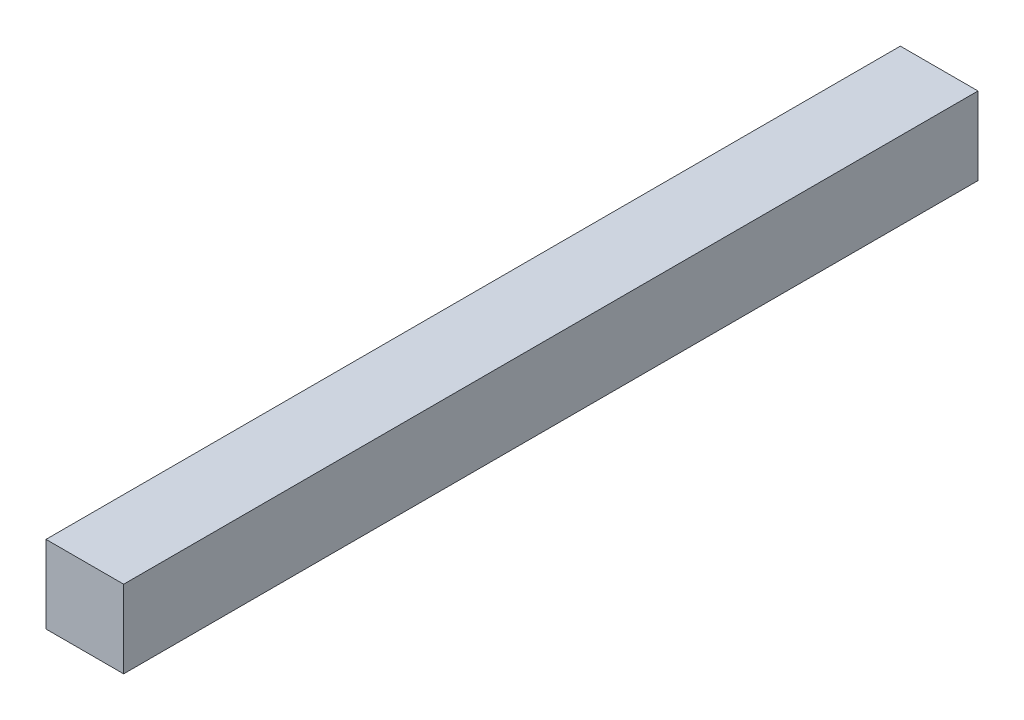
ISO-10303-21;
HEADER;
FILE_DESCRIPTION(('STEP AP214'),'2;1');
FILE_NAME('part.step','',(''),(''),'','','');
FILE_SCHEMA(('AUTOMOTIVE_DESIGN { 1 0 10303 214 1 1 1 1 }'));
ENDSEC;
DATA;
#1=APPLICATION_CONTEXT('core data for automotive mechanical design processes');
#2=APPLICATION_PROTOCOL_DEFINITION('international standard','automotive_design',2000,#1);
#3=PRODUCT_CONTEXT('',#1,'mechanical');
#4=PRODUCT('Part','Part','',(#3));
#5=PRODUCT_RELATED_PRODUCT_CATEGORY('part','',(#4));
#6=PRODUCT_DEFINITION_FORMATION('','',#4);
#7=PRODUCT_DEFINITION_CONTEXT('part definition',#1,'design');
#8=PRODUCT_DEFINITION('design','',#6,#7);
#9=PRODUCT_DEFINITION_SHAPE('','',#8);
#10=(LENGTH_UNIT() NAMED_UNIT(*) SI_UNIT(.MILLI.,.METRE.));
#11=(NAMED_UNIT(*) PLANE_ANGLE_UNIT() SI_UNIT($,.RADIAN.));
#12=(NAMED_UNIT(*) SI_UNIT($,.STERADIAN.) SOLID_ANGLE_UNIT());
#13=UNCERTAINTY_MEASURE_WITH_UNIT(LENGTH_MEASURE(1.E-05),#10,'distance_accuracy_value','');
#14=(GEOMETRIC_REPRESENTATION_CONTEXT(3) GLOBAL_UNCERTAINTY_ASSIGNED_CONTEXT((#13)) GLOBAL_UNIT_ASSIGNED_CONTEXT((#10,
#11,#12)) REPRESENTATION_CONTEXT('',''));
#15=CARTESIAN_POINT('',(0.,0.,0.));
#16=DIRECTION('',(0.,0.,1.));
#17=DIRECTION('',(1.,0.,0.));
#18=AXIS2_PLACEMENT_3D('',#15,#16,#17);
#19=CARTESIAN_POINT('',(15.,-15.,165.));
#20=DIRECTION('',(-1.,0.,0.));
#21=DIRECTION('',(0.,0.,1.));
#22=AXIS2_PLACEMENT_3D('',#19,#20,#21);
#23=PLANE('',#22);
#24=DIRECTION('',(0.,1.,0.));
#25=VECTOR('',#24,1.);
#26=CARTESIAN_POINT('',(15.,-15.,-165.));
#27=LINE('',#26,#25);
#28=CARTESIAN_POINT('',(15.,-15.,-165.));
#29=VERTEX_POINT('',#28);
#30=CARTESIAN_POINT('',(15.,15.,-165.));
#31=VERTEX_POINT('',#30);
#32=EDGE_CURVE('E98',#29,#31,#27,.T.);
#33=ORIENTED_EDGE('',*,*,#32,.T.);
#34=DIRECTION('',(0.,0.,-1.));
#35=VECTOR('',#34,1.);
#36=CARTESIAN_POINT('',(15.,15.,165.));
#37=LINE('',#36,#35);
#38=CARTESIAN_POINT('',(15.,15.,165.));
#39=VERTEX_POINT('',#38);
#40=EDGE_CURVE('E11',#39,#31,#37,.T.);
#41=ORIENTED_EDGE('',*,*,#40,.F.);
#42=DIRECTION('',(0.,1.,0.));
#43=VECTOR('',#42,1.);
#44=CARTESIAN_POINT('',(15.,-15.,165.));
#45=LINE('',#44,#43);
#46=CARTESIAN_POINT('',(15.,-15.,165.));
#47=VERTEX_POINT('',#46);
#48=EDGE_CURVE('E86',#47,#39,#45,.T.);
#49=ORIENTED_EDGE('',*,*,#48,.F.);
#50=DIRECTION('',(0.,0.,-1.));
#51=VECTOR('',#50,1.);
#52=CARTESIAN_POINT('',(15.,-15.,165.));
#53=LINE('',#52,#51);
#54=EDGE_CURVE('E94',#47,#29,#53,.T.);
#55=ORIENTED_EDGE('',*,*,#54,.T.);
#56=EDGE_LOOP('',(#33,#41,#49,#55));
#57=FACE_BOUND('',#56,.T.);
#58=ADVANCED_FACE('F35',(#57),#23,.F.);
#59=CARTESIAN_POINT('',(-15.,15.,165.));
#60=DIRECTION('',(0.,-1.,0.));
#61=DIRECTION('',(0.,0.,-1.));
#62=AXIS2_PLACEMENT_3D('',#59,#60,#61);
#63=PLANE('',#62);
#64=DIRECTION('',(-1.,0.,0.));
#65=VECTOR('',#64,1.);
#66=CARTESIAN_POINT('',(-15.,15.,-165.));
#67=LINE('',#66,#65);
#68=CARTESIAN_POINT('',(-15.,15.,-165.));
#69=VERTEX_POINT('',#68);
#70=EDGE_CURVE('E90',#31,#69,#67,.T.);
#71=ORIENTED_EDGE('',*,*,#70,.T.);
#72=DIRECTION('',(0.,0.,-1.));
#73=VECTOR('',#72,1.);
#74=CARTESIAN_POINT('',(-15.,15.,165.));
#75=LINE('',#74,#73);
#76=CARTESIAN_POINT('',(-15.,15.,165.));
#77=VERTEX_POINT('',#76);
#78=EDGE_CURVE('E43',#77,#69,#75,.T.);
#79=ORIENTED_EDGE('',*,*,#78,.F.);
#80=DIRECTION('',(-1.,0.,0.));
#81=VECTOR('',#80,1.);
#82=CARTESIAN_POINT('',(-15.,15.,165.));
#83=LINE('',#82,#81);
#84=EDGE_CURVE('E81',#39,#77,#83,.T.);
#85=ORIENTED_EDGE('',*,*,#84,.F.);
#86=ORIENTED_EDGE('',*,*,#40,.T.);
#87=EDGE_LOOP('',(#71,#79,#85,#86));
#88=FACE_BOUND('',#87,.T.);
#89=ADVANCED_FACE('F89',(#88),#63,.F.);
#90=CARTESIAN_POINT('',(-15.,-15.,165.));
#91=DIRECTION('',(1.,0.,0.));
#92=DIRECTION('',(0.,0.,-1.));
#93=AXIS2_PLACEMENT_3D('',#90,#91,#92);
#94=PLANE('',#93);
#95=DIRECTION('',(0.,-1.,0.));
#96=VECTOR('',#95,1.);
#97=CARTESIAN_POINT('',(-15.,-15.,-165.));
#98=LINE('',#97,#96);
#99=CARTESIAN_POINT('',(-15.,-15.,-165.));
#100=VERTEX_POINT('',#99);
#101=EDGE_CURVE('E68',#69,#100,#98,.T.);
#102=ORIENTED_EDGE('',*,*,#101,.T.);
#103=DIRECTION('',(0.,0.,-1.));
#104=VECTOR('',#103,1.);
#105=CARTESIAN_POINT('',(-15.,-15.,165.));
#106=LINE('',#105,#104);
#107=CARTESIAN_POINT('',(-15.,-15.,165.));
#108=VERTEX_POINT('',#107);
#109=EDGE_CURVE('E91',#108,#100,#106,.T.);
#110=ORIENTED_EDGE('',*,*,#109,.F.);
#111=DIRECTION('',(0.,-1.,0.));
#112=VECTOR('',#111,1.);
#113=CARTESIAN_POINT('',(-15.,-15.,165.));
#114=LINE('',#113,#112);
#115=EDGE_CURVE('E84',#77,#108,#114,.T.);
#116=ORIENTED_EDGE('',*,*,#115,.F.);
#117=ORIENTED_EDGE('',*,*,#78,.T.);
#118=EDGE_LOOP('',(#102,#110,#116,#117));
#119=FACE_BOUND('',#118,.T.);
#120=ADVANCED_FACE('F92',(#119),#94,.F.);
#121=CARTESIAN_POINT('',(-15.,-15.,165.));
#122=DIRECTION('',(0.,1.,0.));
#123=DIRECTION('',(0.,0.,1.));
#124=AXIS2_PLACEMENT_3D('',#121,#122,#123);
#125=PLANE('',#124);
#126=DIRECTION('',(1.,0.,0.));
#127=VECTOR('',#126,1.);
#128=CARTESIAN_POINT('',(-15.,-15.,-165.));
#129=LINE('',#128,#127);
#130=EDGE_CURVE('E74',#100,#29,#129,.T.);
#131=ORIENTED_EDGE('',*,*,#130,.T.);
#132=ORIENTED_EDGE('',*,*,#54,.F.);
#133=DIRECTION('',(1.,0.,0.));
#134=VECTOR('',#133,1.);
#135=CARTESIAN_POINT('',(-15.,-15.,165.));
#136=LINE('',#135,#134);
#137=EDGE_CURVE('E51',#108,#47,#136,.T.);
#138=ORIENTED_EDGE('',*,*,#137,.F.);
#139=ORIENTED_EDGE('',*,*,#109,.T.);
#140=EDGE_LOOP('',(#131,#132,#138,#139));
#141=FACE_BOUND('',#140,.T.);
#142=ADVANCED_FACE('F105',(#141),#125,.F.);
#143=CARTESIAN_POINT('',(0.,0.,165.));
#144=DIRECTION('',(0.,0.,-1.));
#145=DIRECTION('',(-1.,0.,0.));
#146=AXIS2_PLACEMENT_3D('',#143,#144,#145);
#147=PLANE('',#146);
#148=ORIENTED_EDGE('',*,*,#48,.T.);
#149=ORIENTED_EDGE('',*,*,#84,.T.);
#150=ORIENTED_EDGE('',*,*,#115,.T.);
#151=ORIENTED_EDGE('',*,*,#137,.T.);
#152=EDGE_LOOP('',(#148,#149,#150,#151));
#153=FACE_BOUND('',#152,.T.);
#154=ADVANCED_FACE('F82',(#153),#147,.F.);
#155=CARTESIAN_POINT('',(0.,0.,-165.));
#156=DIRECTION('',(0.,0.,-1.));
#157=DIRECTION('',(-1.,0.,0.));
#158=AXIS2_PLACEMENT_3D('',#155,#156,#157);
#159=PLANE('',#158);
#160=ORIENTED_EDGE('',*,*,#32,.F.);
#161=ORIENTED_EDGE('',*,*,#130,.F.);
#162=ORIENTED_EDGE('',*,*,#101,.F.);
#163=ORIENTED_EDGE('',*,*,#70,.F.);
#164=EDGE_LOOP('',(#160,#161,#162,#163));
#165=FACE_BOUND('',#164,.T.);
#166=ADVANCED_FACE('F108',(#165),#159,.T.);
#167=CLOSED_SHELL('',(#58,#89,#120,#142,#154,#166));
#168=MANIFOLD_SOLID_BREP('B2',#167);
#169=ADVANCED_BREP_SHAPE_REPRESENTATION('',(#18,#168),#14);
#170=SHAPE_DEFINITION_REPRESENTATION(#9,#169);
ENDSEC;
END-ISO-10303-21;
